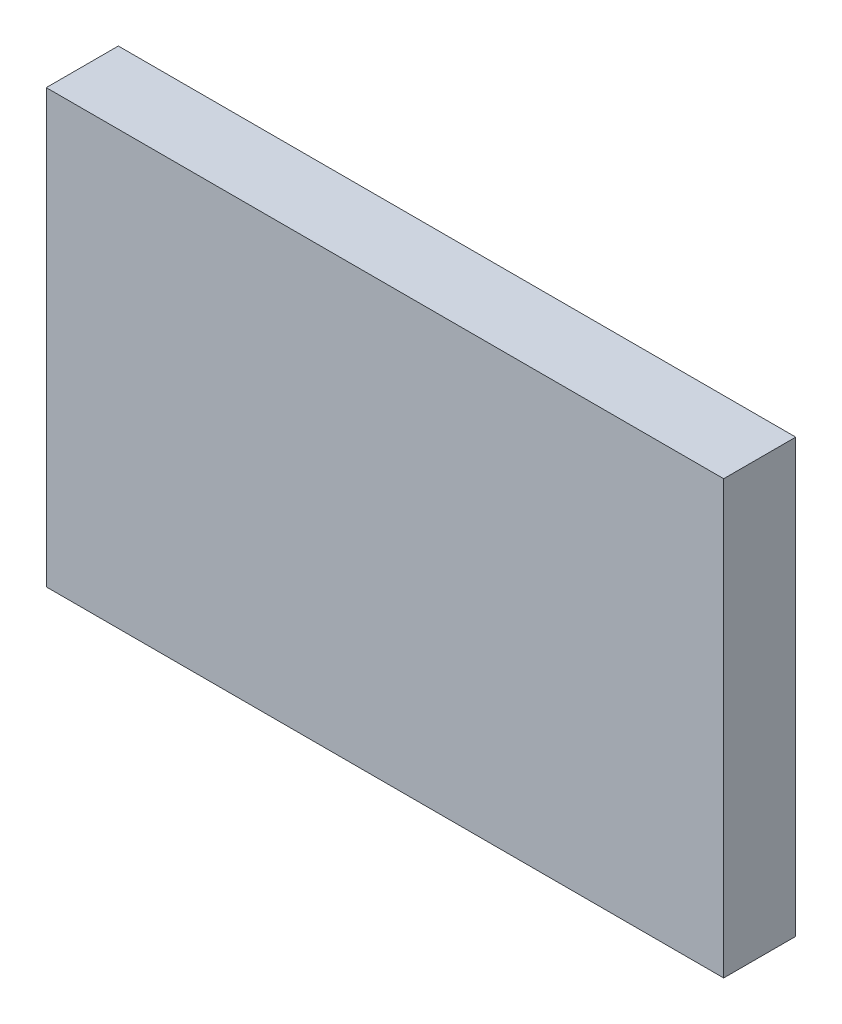
ISO-10303-21;
HEADER;
FILE_DESCRIPTION(('STEP AP214'),'2;1');
FILE_NAME('part.step','',(''),(''),'','','');
FILE_SCHEMA(('AUTOMOTIVE_DESIGN { 1 0 10303 214 1 1 1 1 }'));
ENDSEC;
DATA;
#1=APPLICATION_CONTEXT('core data for automotive mechanical design processes');
#2=APPLICATION_PROTOCOL_DEFINITION('international standard','automotive_design',2000,#1);
#3=PRODUCT_CONTEXT('',#1,'mechanical');
#4=PRODUCT('Part','Part','',(#3));
#5=PRODUCT_RELATED_PRODUCT_CATEGORY('part','',(#4));
#6=PRODUCT_DEFINITION_FORMATION('','',#4);
#7=PRODUCT_DEFINITION_CONTEXT('part definition',#1,'design');
#8=PRODUCT_DEFINITION('design','',#6,#7);
#9=PRODUCT_DEFINITION_SHAPE('','',#8);
#10=(LENGTH_UNIT() NAMED_UNIT(*) SI_UNIT(.MILLI.,.METRE.));
#11=(NAMED_UNIT(*) PLANE_ANGLE_UNIT() SI_UNIT($,.RADIAN.));
#12=(NAMED_UNIT(*) SI_UNIT($,.STERADIAN.) SOLID_ANGLE_UNIT());
#13=UNCERTAINTY_MEASURE_WITH_UNIT(LENGTH_MEASURE(1.E-05),#10,'distance_accuracy_value','');
#14=(GEOMETRIC_REPRESENTATION_CONTEXT(3) GLOBAL_UNCERTAINTY_ASSIGNED_CONTEXT((#13)) GLOBAL_UNIT_ASSIGNED_CONTEXT((#10,
#11,#12)) REPRESENTATION_CONTEXT('',''));
#15=CARTESIAN_POINT('',(0.,0.,0.));
#16=DIRECTION('',(0.,0.,1.));
#17=DIRECTION('',(1.,0.,0.));
#18=AXIS2_PLACEMENT_3D('',#15,#16,#17);
#19=CARTESIAN_POINT('',(-47.,-30.,10.));
#20=DIRECTION('',(1.,0.,0.));
#21=DIRECTION('',(0.,0.,-1.));
#22=AXIS2_PLACEMENT_3D('',#19,#20,#21);
#23=PLANE('',#22);
#24=DIRECTION('',(0.,-1.,0.));
#25=VECTOR('',#24,1.);
#26=CARTESIAN_POINT('',(-47.,-30.,0.));
#27=LINE('',#26,#25);
#28=CARTESIAN_POINT('',(-47.,30.,0.));
#29=VERTEX_POINT('',#28);
#30=CARTESIAN_POINT('',(-47.,-30.,0.));
#31=VERTEX_POINT('',#30);
#32=EDGE_CURVE('E98',#29,#31,#27,.T.);
#33=ORIENTED_EDGE('',*,*,#32,.T.);
#34=DIRECTION('',(0.,0.,-1.));
#35=VECTOR('',#34,1.);
#36=CARTESIAN_POINT('',(-47.,-30.,10.));
#37=LINE('',#36,#35);
#38=CARTESIAN_POINT('',(-47.,-30.,10.));
#39=VERTEX_POINT('',#38);
#40=EDGE_CURVE('E11',#39,#31,#37,.T.);
#41=ORIENTED_EDGE('',*,*,#40,.F.);
#42=DIRECTION('',(0.,-1.,0.));
#43=VECTOR('',#42,1.);
#44=CARTESIAN_POINT('',(-47.,-30.,10.));
#45=LINE('',#44,#43);
#46=CARTESIAN_POINT('',(-47.,30.,10.));
#47=VERTEX_POINT('',#46);
#48=EDGE_CURVE('E86',#47,#39,#45,.T.);
#49=ORIENTED_EDGE('',*,*,#48,.F.);
#50=DIRECTION('',(0.,0.,-1.));
#51=VECTOR('',#50,1.);
#52=CARTESIAN_POINT('',(-47.,30.,10.));
#53=LINE('',#52,#51);
#54=EDGE_CURVE('E94',#47,#29,#53,.T.);
#55=ORIENTED_EDGE('',*,*,#54,.T.);
#56=EDGE_LOOP('',(#33,#41,#49,#55));
#57=FACE_BOUND('',#56,.T.);
#58=ADVANCED_FACE('F35',(#57),#23,.F.);
#59=CARTESIAN_POINT('',(47.,-30.,10.));
#60=DIRECTION('',(0.,1.,0.));
#61=DIRECTION('',(-1.,0.,0.));
#62=AXIS2_PLACEMENT_3D('',#59,#60,#61);
#63=PLANE('',#62);
#64=DIRECTION('',(1.,0.,0.));
#65=VECTOR('',#64,1.);
#66=CARTESIAN_POINT('',(47.,-30.,0.));
#67=LINE('',#66,#65);
#68=CARTESIAN_POINT('',(47.,-30.,0.));
#69=VERTEX_POINT('',#68);
#70=EDGE_CURVE('E90',#31,#69,#67,.T.);
#71=ORIENTED_EDGE('',*,*,#70,.T.);
#72=DIRECTION('',(0.,0.,-1.));
#73=VECTOR('',#72,1.);
#74=CARTESIAN_POINT('',(47.,-30.,10.));
#75=LINE('',#74,#73);
#76=CARTESIAN_POINT('',(47.,-30.,10.));
#77=VERTEX_POINT('',#76);
#78=EDGE_CURVE('E43',#77,#69,#75,.T.);
#79=ORIENTED_EDGE('',*,*,#78,.F.);
#80=DIRECTION('',(1.,0.,0.));
#81=VECTOR('',#80,1.);
#82=CARTESIAN_POINT('',(47.,-30.,10.));
#83=LINE('',#82,#81);
#84=EDGE_CURVE('E81',#39,#77,#83,.T.);
#85=ORIENTED_EDGE('',*,*,#84,.F.);
#86=ORIENTED_EDGE('',*,*,#40,.T.);
#87=EDGE_LOOP('',(#71,#79,#85,#86));
#88=FACE_BOUND('',#87,.T.);
#89=ADVANCED_FACE('F89',(#88),#63,.F.);
#90=CARTESIAN_POINT('',(47.,-30.,10.));
#91=DIRECTION('',(-1.,0.,0.));
#92=DIRECTION('',(0.,0.,1.));
#93=AXIS2_PLACEMENT_3D('',#90,#91,#92);
#94=PLANE('',#93);
#95=DIRECTION('',(0.,1.,0.));
#96=VECTOR('',#95,1.);
#97=CARTESIAN_POINT('',(47.,-30.,0.));
#98=LINE('',#97,#96);
#99=CARTESIAN_POINT('',(47.,30.,0.));
#100=VERTEX_POINT('',#99);
#101=EDGE_CURVE('E68',#69,#100,#98,.T.);
#102=ORIENTED_EDGE('',*,*,#101,.T.);
#103=DIRECTION('',(0.,0.,-1.));
#104=VECTOR('',#103,1.);
#105=CARTESIAN_POINT('',(47.,30.,10.));
#106=LINE('',#105,#104);
#107=CARTESIAN_POINT('',(47.,30.,10.));
#108=VERTEX_POINT('',#107);
#109=EDGE_CURVE('E91',#108,#100,#106,.T.);
#110=ORIENTED_EDGE('',*,*,#109,.F.);
#111=DIRECTION('',(0.,1.,0.));
#112=VECTOR('',#111,1.);
#113=CARTESIAN_POINT('',(47.,-30.,10.));
#114=LINE('',#113,#112);
#115=EDGE_CURVE('E84',#77,#108,#114,.T.);
#116=ORIENTED_EDGE('',*,*,#115,.F.);
#117=ORIENTED_EDGE('',*,*,#78,.T.);
#118=EDGE_LOOP('',(#102,#110,#116,#117));
#119=FACE_BOUND('',#118,.T.);
#120=ADVANCED_FACE('F92',(#119),#94,.F.);
#121=CARTESIAN_POINT('',(47.,30.,10.));
#122=DIRECTION('',(0.,-1.,0.));
#123=DIRECTION('',(1.,0.,0.));
#124=AXIS2_PLACEMENT_3D('',#121,#122,#123);
#125=PLANE('',#124);
#126=DIRECTION('',(-1.,0.,0.));
#127=VECTOR('',#126,1.);
#128=CARTESIAN_POINT('',(47.,30.,0.));
#129=LINE('',#128,#127);
#130=EDGE_CURVE('E74',#100,#29,#129,.T.);
#131=ORIENTED_EDGE('',*,*,#130,.T.);
#132=ORIENTED_EDGE('',*,*,#54,.F.);
#133=DIRECTION('',(-1.,0.,0.));
#134=VECTOR('',#133,1.);
#135=CARTESIAN_POINT('',(47.,30.,10.));
#136=LINE('',#135,#134);
#137=EDGE_CURVE('E51',#108,#47,#136,.T.);
#138=ORIENTED_EDGE('',*,*,#137,.F.);
#139=ORIENTED_EDGE('',*,*,#109,.T.);
#140=EDGE_LOOP('',(#131,#132,#138,#139));
#141=FACE_BOUND('',#140,.T.);
#142=ADVANCED_FACE('F105',(#141),#125,.F.);
#143=CARTESIAN_POINT('',(0.,0.,10.));
#144=DIRECTION('',(0.,0.,1.));
#145=DIRECTION('',(1.,0.,0.));
#146=AXIS2_PLACEMENT_3D('',#143,#144,#145);
#147=PLANE('',#146);
#148=ORIENTED_EDGE('',*,*,#48,.T.);
#149=ORIENTED_EDGE('',*,*,#84,.T.);
#150=ORIENTED_EDGE('',*,*,#115,.T.);
#151=ORIENTED_EDGE('',*,*,#137,.T.);
#152=EDGE_LOOP('',(#148,#149,#150,#151));
#153=FACE_BOUND('',#152,.T.);
#154=ADVANCED_FACE('F82',(#153),#147,.T.);
#155=CARTESIAN_POINT('',(0.,0.,0.));
#156=DIRECTION('',(0.,0.,1.));
#157=DIRECTION('',(1.,0.,0.));
#158=AXIS2_PLACEMENT_3D('',#155,#156,#157);
#159=PLANE('',#158);
#160=ORIENTED_EDGE('',*,*,#32,.F.);
#161=ORIENTED_EDGE('',*,*,#130,.F.);
#162=ORIENTED_EDGE('',*,*,#101,.F.);
#163=ORIENTED_EDGE('',*,*,#70,.F.);
#164=EDGE_LOOP('',(#160,#161,#162,#163));
#165=FACE_BOUND('',#164,.T.);
#166=ADVANCED_FACE('F108',(#165),#159,.F.);
#167=CLOSED_SHELL('',(#58,#89,#120,#142,#154,#166));
#168=MANIFOLD_SOLID_BREP('B2',#167);
#169=ADVANCED_BREP_SHAPE_REPRESENTATION('',(#18,#168),#14);
#170=SHAPE_DEFINITION_REPRESENTATION(#9,#169);
ENDSEC;
END-ISO-10303-21;
